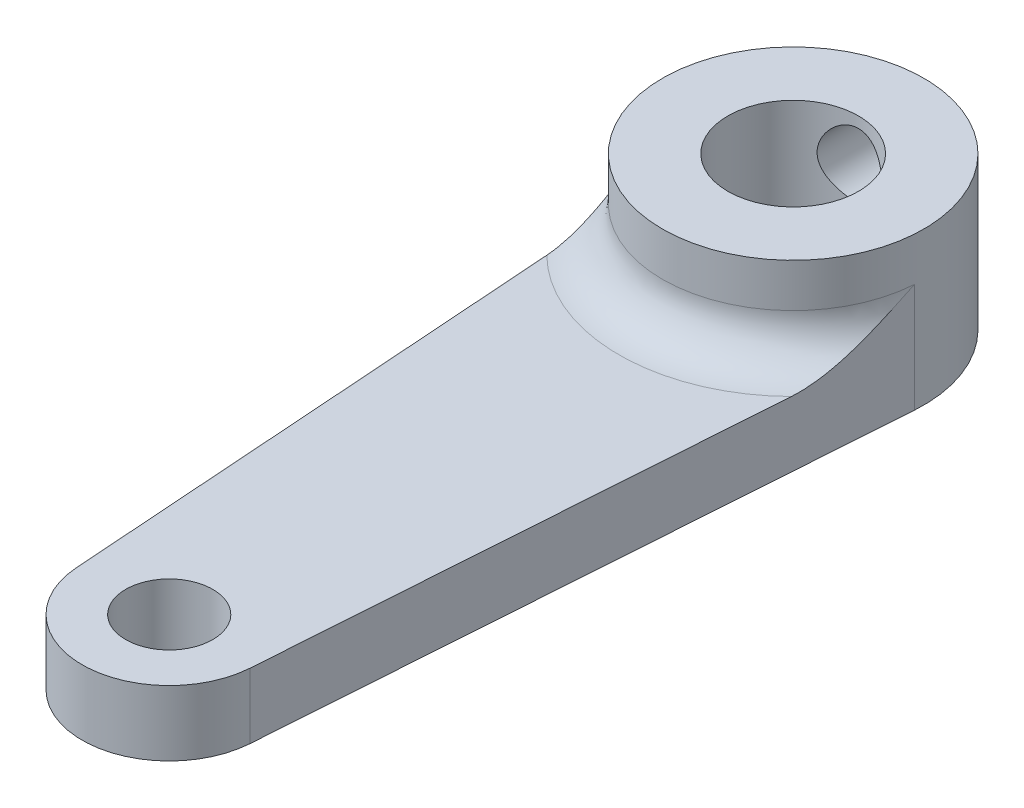
ISO-10303-21;
HEADER;
FILE_DESCRIPTION(('STEP AP214'),'2;1');
FILE_NAME('part.step','',(''),(''),'','','');
FILE_SCHEMA(('AUTOMOTIVE_DESIGN { 1 0 10303 214 1 1 1 1 }'));
ENDSEC;
DATA;
#1=APPLICATION_CONTEXT('core data for automotive mechanical design processes');
#2=APPLICATION_PROTOCOL_DEFINITION('international standard','automotive_design',2000,#1);
#3=PRODUCT_CONTEXT('',#1,'mechanical');
#4=PRODUCT('Part','Part','',(#3));
#5=PRODUCT_RELATED_PRODUCT_CATEGORY('part','',(#4));
#6=PRODUCT_DEFINITION_FORMATION('','',#4);
#7=PRODUCT_DEFINITION_CONTEXT('part definition',#1,'design');
#8=PRODUCT_DEFINITION('design','',#6,#7);
#9=PRODUCT_DEFINITION_SHAPE('','',#8);
#10=(LENGTH_UNIT() NAMED_UNIT(*) SI_UNIT(.MILLI.,.METRE.));
#11=(NAMED_UNIT(*) PLANE_ANGLE_UNIT() SI_UNIT($,.RADIAN.));
#12=(NAMED_UNIT(*) SI_UNIT($,.STERADIAN.) SOLID_ANGLE_UNIT());
#13=UNCERTAINTY_MEASURE_WITH_UNIT(LENGTH_MEASURE(1.E-05),#10,'distance_accuracy_value','');
#14=(GEOMETRIC_REPRESENTATION_CONTEXT(3) GLOBAL_UNCERTAINTY_ASSIGNED_CONTEXT((#13)) GLOBAL_UNIT_ASSIGNED_CONTEXT((#10,
#11,#12)) REPRESENTATION_CONTEXT('',''));
#15=CARTESIAN_POINT('',(0.,0.,0.));
#16=DIRECTION('',(0.,0.,1.));
#17=DIRECTION('',(1.,0.,0.));
#18=AXIS2_PLACEMENT_3D('',#15,#16,#17);
#19=CARTESIAN_POINT('',(-5.98535814810819,1.5,0.418912686457355));
#20=DIRECTION('',(0.997559691351365,0.,-0.0698187810762258));
#21=DIRECTION('',(-0.0698187810762258,0.,-0.997559691351365));
#22=AXIS2_PLACEMENT_3D('',#19,#20,#21);
#23=PLANE('',#22);
#24=DIRECTION('',(0.0698187810762258,0.,0.997559691351365));
#25=VECTOR('',#24,1.);
#26=CARTESIAN_POINT('',(-5.98535814810819,-1.5,0.418912686457355));
#27=LINE('',#26,#25);
#28=CARTESIAN_POINT('',(-5.98535814810819,-1.5,0.418912686457355));
#29=VERTEX_POINT('',#28);
#30=CARTESIAN_POINT('',(-3.99023876540546,-1.5,28.9248625890369));
#31=VERTEX_POINT('',#30);
#32=EDGE_CURVE('E111',#29,#31,#27,.T.);
#33=ORIENTED_EDGE('',*,*,#32,.T.);
#34=DIRECTION('',(0.,-1.,0.));
#35=VECTOR('',#34,1.);
#36=CARTESIAN_POINT('',(-3.99023876540546,1.5,28.9248625890369));
#37=LINE('',#36,#35);
#38=CARTESIAN_POINT('',(-3.99023876540546,1.5,28.9248625890369));
#39=VERTEX_POINT('',#38);
#40=EDGE_CURVE('E104',#39,#31,#37,.T.);
#41=ORIENTED_EDGE('',*,*,#40,.F.);
#42=DIRECTION('',(0.0698187810762258,0.,0.997559691351365));
#43=VECTOR('',#42,1.);
#44=CARTESIAN_POINT('',(-5.98535814810819,1.5,0.418912686457355));
#45=LINE('',#44,#43);
#46=CARTESIAN_POINT('',(-5.61591188496948,1.5,5.69750240897348));
#47=VERTEX_POINT('',#46);
#48=EDGE_CURVE('E89',#47,#39,#45,.T.);
#49=ORIENTED_EDGE('',*,*,#48,.F.);
#50=CARTESIAN_POINT('',(-5.61591188496948,1.5,5.69750240897348));
#51=CARTESIAN_POINT('',(-5.62646580235453,1.50003932371851,5.54670970811425));
#52=CARTESIAN_POINT('',(-5.63700724368848,1.50749080861604,5.39609526309823));
#53=CARTESIAN_POINT('',(-5.65798592108005,1.5352974881444,5.09635524155803));
#54=CARTESIAN_POINT('',(-5.66842333172275,1.55562506504869,4.94722717058997));
#55=CARTESIAN_POINT('',(-5.68901177676282,1.60690972129862,4.6530627271123));
#56=CARTESIAN_POINT('',(-5.69916477169051,1.63771036698734,4.50799834285586));
#57=CARTESIAN_POINT('',(-5.71931793297161,1.70848018103601,4.2200531648187));
#58=CARTESIAN_POINT('',(-5.72931800686936,1.74845467894677,4.07717369202996));
#59=CARTESIAN_POINT('',(-5.76088136861305,1.88804779430901,3.62620137607563));
#60=CARTESIAN_POINT('',(-5.7821296938135,2.00228369716543,3.3226086693289));
#61=CARTESIAN_POINT('',(-5.82388202620795,2.25580816906808,2.72605795368212));
#62=CARTESIAN_POINT('',(-5.84438514311566,2.39512559194236,2.43311266505178));
#63=CARTESIAN_POINT('',(-5.90531581435697,2.83812108027953,1.56254487998891));
#64=CARTESIAN_POINT('',(-5.94488668719295,3.16533067275195,0.997162513177504));
#65=CARTESIAN_POINT('',(-5.98473367163637,3.49483605454573,0.427835107428977));
#66=CARTESIAN_POINT('',(-5.98504591072785,3.49741804396543,0.423373884718887));
#67=CARTESIAN_POINT('',(-5.98535814810819,3.5,0.418912686457355));
#68=B_SPLINE_CURVE_WITH_KNOTS('',3,(#50,#51,#52,#53,#54,#55,#56,#57,#58,#59,#60,#61,#62,#63,#64,
#65,#66,#67),.UNSPECIFIED.,.F.,.F.,(4,2,2,2,2,2,2,2,4),(0.,0.453047985173767,0.905127510167508,
1.35073120961627,1.79659444088085,2.76988627914173,3.74430503334712,5.70583133706974,
5.72132327058452),.UNSPECIFIED.);
#69=CARTESIAN_POINT('',(-5.98535814810819,3.5,0.418912686457355));
#70=VERTEX_POINT('',#69);
#71=EDGE_CURVE('E11',#47,#70,#68,.T.);
#72=ORIENTED_EDGE('',*,*,#71,.T.);
#73=DIRECTION('',(0.,-1.,0.));
#74=VECTOR('',#73,1.);
#75=CARTESIAN_POINT('',(-5.98535814810819,1.5,0.418912686457355));
#76=LINE('',#75,#74);
#77=EDGE_CURVE('E279',#70,#29,#76,.T.);
#78=ORIENTED_EDGE('',*,*,#77,.T.);
#79=EDGE_LOOP('',(#33,#41,#49,#72,#78));
#80=FACE_BOUND('',#79,.T.);
#81=ADVANCED_FACE('F38',(#80),#23,.F.);
#82=CARTESIAN_POINT('',(0.,1.5,28.645587464732));
#83=DIRECTION('',(0.,-1.,0.));
#84=DIRECTION('',(0.,0.,-1.));
#85=AXIS2_PLACEMENT_3D('',#82,#83,#84);
#86=CYLINDRICAL_SURFACE('',#85,4.);
#87=CARTESIAN_POINT('',(0.,-1.5,28.645587464732));
#88=DIRECTION('',(0.,1.,0.));
#89=DIRECTION('',(0.,0.,1.));
#90=AXIS2_PLACEMENT_3D('',#87,#88,#89);
#91=CIRCLE('',#90,4.);
#92=CARTESIAN_POINT('',(3.99023876540546,-1.5,28.9248625890369));
#93=VERTEX_POINT('',#92);
#94=EDGE_CURVE('E281',#31,#93,#91,.T.);
#95=ORIENTED_EDGE('',*,*,#94,.T.);
#96=DIRECTION('',(0.,-1.,0.));
#97=VECTOR('',#96,1.);
#98=CARTESIAN_POINT('',(3.99023876540546,1.5,28.9248625890369));
#99=LINE('',#98,#97);
#100=CARTESIAN_POINT('',(3.99023876540546,1.5,28.9248625890369));
#101=VERTEX_POINT('',#100);
#102=EDGE_CURVE('E106',#101,#93,#99,.T.);
#103=ORIENTED_EDGE('',*,*,#102,.F.);
#104=CARTESIAN_POINT('',(0.,1.5,28.645587464732));
#105=DIRECTION('',(0.,1.,0.));
#106=DIRECTION('',(0.,0.,1.));
#107=AXIS2_PLACEMENT_3D('',#104,#105,#106);
#108=CIRCLE('',#107,4.);
#109=EDGE_CURVE('E93',#39,#101,#108,.T.);
#110=ORIENTED_EDGE('',*,*,#109,.F.);
#111=ORIENTED_EDGE('',*,*,#40,.T.);
#112=EDGE_LOOP('',(#95,#103,#110,#111));
#113=FACE_BOUND('',#112,.T.);
#114=ADVANCED_FACE('F103',(#113),#86,.T.);
#115=CARTESIAN_POINT('',(5.98535814810819,1.5,0.418912686457355));
#116=DIRECTION('',(0.997559691351365,0.,0.0698187810762258));
#117=DIRECTION('',(0.0698187810762258,0.,-0.997559691351365));
#118=AXIS2_PLACEMENT_3D('',#115,#116,#117);
#119=PLANE('',#118);
#120=DIRECTION('',(-0.0698187810762258,0.,0.997559691351365));
#121=VECTOR('',#120,1.);
#122=CARTESIAN_POINT('',(5.98535814810819,-1.5,0.418912686457355));
#123=LINE('',#122,#121);
#124=CARTESIAN_POINT('',(5.98535814810819,-1.5,0.418912686457355));
#125=VERTEX_POINT('',#124);
#126=EDGE_CURVE('E283',#125,#93,#123,.T.);
#127=ORIENTED_EDGE('',*,*,#126,.F.);
#128=DIRECTION('',(0.,-1.,0.));
#129=VECTOR('',#128,1.);
#130=CARTESIAN_POINT('',(5.98535814810819,1.5,0.418912686457355));
#131=LINE('',#130,#129);
#132=CARTESIAN_POINT('',(5.98535814810819,3.5,0.418912686457355));
#133=VERTEX_POINT('',#132);
#134=EDGE_CURVE('E116',#133,#125,#131,.T.);
#135=ORIENTED_EDGE('',*,*,#134,.F.);
#136=CARTESIAN_POINT('',(5.61591188496948,1.5,5.69750240897348));
#137=CARTESIAN_POINT('',(5.62646580235453,1.50003932371851,5.54670970811425));
#138=CARTESIAN_POINT('',(5.63700724368848,1.50749080861604,5.39609526309823));
#139=CARTESIAN_POINT('',(5.65798592108005,1.5352974881444,5.09635524155803));
#140=CARTESIAN_POINT('',(5.66842333172275,1.55562506504869,4.94722717058997));
#141=CARTESIAN_POINT('',(5.68901177676282,1.60690972129862,4.6530627271123));
#142=CARTESIAN_POINT('',(5.69916477169051,1.63771036698734,4.50799834285586));
#143=CARTESIAN_POINT('',(5.71931793297161,1.70848018103601,4.2200531648187));
#144=CARTESIAN_POINT('',(5.72931800686936,1.74845467894677,4.07717369202996));
#145=CARTESIAN_POINT('',(5.76088136861305,1.88804779430901,3.62620137607563));
#146=CARTESIAN_POINT('',(5.7821296938135,2.00228369716543,3.3226086693289));
#147=CARTESIAN_POINT('',(5.82388202620795,2.25580816906808,2.72605795368212));
#148=CARTESIAN_POINT('',(5.84438514311566,2.39512559194236,2.43311266505178));
#149=CARTESIAN_POINT('',(5.90531581435697,2.83812108027953,1.56254487998891));
#150=CARTESIAN_POINT('',(5.94488668719295,3.16533067275195,0.997162513177504));
#151=CARTESIAN_POINT('',(5.98473367163637,3.49483605454573,0.427835107428977));
#152=CARTESIAN_POINT('',(5.98504591072785,3.49741804396543,0.423373884718887));
#153=CARTESIAN_POINT('',(5.98535814810819,3.5,0.418912686457355));
#154=B_SPLINE_CURVE_WITH_KNOTS('',3,(#136,#137,#138,#139,#140,#141,#142,#143,#144,#145,#146,
#147,#148,#149,#150,#151,#152,#153),.UNSPECIFIED.,.F.,.F.,(4,2,2,2,2,2,2,2,4),(0.,
0.453047985173767,0.905127510167508,1.35073120961627,1.79659444088085,2.76988627914173,
3.74430503334712,5.70583133706974,5.72132327058452),.UNSPECIFIED.);
#155=CARTESIAN_POINT('',(5.61591188496948,1.5,5.69750240897348));
#156=VERTEX_POINT('',#155);
#157=EDGE_CURVE('E53',#133,#156,#154,.F.);
#158=ORIENTED_EDGE('',*,*,#157,.T.);
#159=DIRECTION('',(-0.0698187810762258,0.,0.997559691351365));
#160=VECTOR('',#159,1.);
#161=CARTESIAN_POINT('',(5.98535814810819,1.5,0.418912686457355));
#162=LINE('',#161,#160);
#163=EDGE_CURVE('E107',#156,#101,#162,.T.);
#164=ORIENTED_EDGE('',*,*,#163,.T.);
#165=ORIENTED_EDGE('',*,*,#102,.T.);
#166=EDGE_LOOP('',(#127,#135,#158,#164,#165));
#167=FACE_BOUND('',#166,.T.);
#168=ADVANCED_FACE('F130',(#167),#119,.T.);
#169=CARTESIAN_POINT('',(0.,1.5,28.645587464732));
#170=DIRECTION('',(0.,-1.,0.));
#171=DIRECTION('',(0.,0.,-1.));
#172=AXIS2_PLACEMENT_3D('',#169,#170,#171);
#173=CYLINDRICAL_SURFACE('',#172,2.);
#174=CARTESIAN_POINT('',(0.,1.5,28.645587464732));
#175=DIRECTION('',(0.,1.,0.));
#176=DIRECTION('',(0.,0.,1.));
#177=AXIS2_PLACEMENT_3D('',#174,#175,#176);
#178=CIRCLE('',#177,2.);
#179=CARTESIAN_POINT('',(0.,1.5,30.645587464732));
#180=VERTEX_POINT('',#179);
#181=EDGE_CURVE('E276',#180,#180,#178,.T.);
#182=ORIENTED_EDGE('',*,*,#181,.T.);
#183=EDGE_LOOP('',(#182));
#184=FACE_BOUND('',#183,.T.);
#185=CARTESIAN_POINT('',(0.,-1.5,28.645587464732));
#186=DIRECTION('',(0.,1.,0.));
#187=DIRECTION('',(0.,0.,1.));
#188=AXIS2_PLACEMENT_3D('',#185,#186,#187);
#189=CIRCLE('',#188,2.);
#190=CARTESIAN_POINT('',(0.,-1.5,30.645587464732));
#191=VERTEX_POINT('',#190);
#192=EDGE_CURVE('E288',#191,#191,#189,.T.);
#193=ORIENTED_EDGE('',*,*,#192,.F.);
#194=EDGE_LOOP('',(#193));
#195=FACE_BOUND('',#194,.T.);
#196=ADVANCED_FACE('F134',(#184,#195),#173,.F.);
#197=CARTESIAN_POINT('',(0.,1.5,0.));
#198=DIRECTION('',(0.,-1.,0.));
#199=DIRECTION('',(0.,0.,-1.));
#200=AXIS2_PLACEMENT_3D('',#197,#198,#199);
#201=CYLINDRICAL_SURFACE('',#200,6.);
#202=CARTESIAN_POINT('',(0.,5.,-6.));
#203=CARTESIAN_POINT('',(-0.082876088669731,4.99999767426184,-5.99999859868013));
#204=CARTESIAN_POINT('',(-0.165778157830763,4.99310844922621,-5.99826578131828));
#205=CARTESIAN_POINT('',(-0.329206323770532,4.96577484869299,-5.99152113829892));
#206=CARTESIAN_POINT('',(-0.409731046870739,4.94532279046215,-5.98650745419968));
#207=CARTESIAN_POINT('',(-0.566020872182576,4.89156074653791,-5.9737562633204));
#208=CARTESIAN_POINT('',(-0.641791563430002,4.85826620128472,-5.96602202842087));
#209=CARTESIAN_POINT('',(-0.786672131904426,4.77981860995517,-5.94865343807593));
#210=CARTESIAN_POINT('',(-0.855781784348759,4.73466516388106,-5.9390190185405));
#211=CARTESIAN_POINT('',(-0.986801927300918,4.63279921034579,-5.91867413591801));
#212=CARTESIAN_POINT('',(-1.04855569006107,4.57588842504082,-5.90794707148533));
#213=CARTESIAN_POINT('',(-1.1617489272033,4.45254779509108,-5.8867362011753));
#214=CARTESIAN_POINT('',(-1.21318723694913,4.3861168770535,-5.87625242288349));
#215=CARTESIAN_POINT('',(-1.30502654279903,4.24440477326256,-5.8565477569971));
#216=CARTESIAN_POINT('',(-1.34525221592536,4.1690067691896,-5.84734794470605));
#217=CARTESIAN_POINT('',(-1.41239690855053,4.01225158834164,-5.83149494812223));
#218=CARTESIAN_POINT('',(-1.43931805543933,3.93089536667424,-5.82484135672789));
#219=CARTESIAN_POINT('',(-1.47855483680429,3.76625650179753,-5.81500476717551));
#220=CARTESIAN_POINT('',(-1.49115226833334,3.6830451039502,-5.81175491075426));
#221=CARTESIAN_POINT('',(-1.50226177506785,3.51563143098602,-5.80889362537741));
#222=CARTESIAN_POINT('',(-1.50077614181798,3.43142931930139,-5.80928160448644));
#223=CARTESIAN_POINT('',(-1.48398652463928,3.26658419225552,-5.81359205496618));
#224=CARTESIAN_POINT('',(-1.46901834019052,3.1859043785349,-5.81742863001879));
#225=CARTESIAN_POINT('',(-1.42622418690311,3.02823894908871,-5.82806709676484));
#226=CARTESIAN_POINT('',(-1.39839730206942,2.95125359697102,-5.83486919970697));
#227=CARTESIAN_POINT('',(-1.33038947793715,2.80226198374794,-5.85075113904187));
#228=CARTESIAN_POINT('',(-1.29008666723291,2.73031382821045,-5.85985327469421));
#229=CARTESIAN_POINT('',(-1.19835627601495,2.59408129024316,-5.87929710846386));
#230=CARTESIAN_POINT('',(-1.14692674880884,2.52979825193275,-5.88963902334735));
#231=CARTESIAN_POINT('',(-1.03266342468122,2.4087963843056,-5.91075880539781));
#232=CARTESIAN_POINT('',(-0.969546258165859,2.35234550993865,-5.92154069477971));
#233=CARTESIAN_POINT('',(-0.834611917503699,2.2507787575361,-5.94205965578786));
#234=CARTESIAN_POINT('',(-0.762794477707943,2.20566322573644,-5.95179669549415));
#235=CARTESIAN_POINT('',(-0.612115888681391,2.12794941377562,-5.96917732094183));
#236=CARTESIAN_POINT('',(-0.533231393208623,2.09539465974557,-5.97681360127725));
#237=CARTESIAN_POINT('',(-0.370876008142883,2.04408269429043,-5.98907916991419));
#238=CARTESIAN_POINT('',(-0.287405999150485,2.02532284358186,-5.99370903339281));
#239=CARTESIAN_POINT('',(-0.120539970390027,2.00254243444116,-5.99935499271375));
#240=CARTESIAN_POINT('',(-0.0371967199882099,1.9981569739247,-6.00046053508279));
#241=CARTESIAN_POINT('',(0.129032874801508,2.00324900205549,-5.99918804814451));
#242=CARTESIAN_POINT('',(0.211919259644594,2.01272524279913,-5.99681033241847));
#243=CARTESIAN_POINT('',(0.373614268776491,2.04497090839138,-5.98889581127357));
#244=CARTESIAN_POINT('',(0.452465118968754,2.06754126347699,-5.98340634185811));
#245=CARTESIAN_POINT('',(0.605257292452511,2.12510708402845,-5.96988706634134));
#246=CARTESIAN_POINT('',(0.679198119032633,2.16010380431317,-5.96185700369892));
#247=CARTESIAN_POINT('',(0.821523134429846,2.24223612887473,-5.9439330792631));
#248=CARTESIAN_POINT('',(0.889785441835829,2.28957611239676,-5.93400867366932));
#249=CARTESIAN_POINT('',(1.01752661364324,2.39478990879697,-5.91344509187419));
#250=CARTESIAN_POINT('',(1.07700395897301,2.45266553961691,-5.90280579251705));
#251=CARTESIAN_POINT('',(1.18699056807273,2.57900196084446,-5.88168956960771));
#252=CARTESIAN_POINT('',(1.23724386762203,2.64768770300242,-5.87122304187281));
#253=CARTESIAN_POINT('',(1.3255107590127,2.79273263446572,-5.85192878377239));
#254=CARTESIAN_POINT('',(1.36352489415793,2.86909148295975,-5.84310098067026));
#255=CARTESIAN_POINT('',(1.42595142060929,3.02690572241308,-5.82818094734665));
#256=CARTESIAN_POINT('',(1.45044439665406,3.10832762834401,-5.82207255291906));
#257=CARTESIAN_POINT('',(1.48534565995378,3.27430963788911,-5.81326744090184));
#258=CARTESIAN_POINT('',(1.49575702747866,3.35886905103249,-5.81056997719936));
#259=CARTESIAN_POINT('',(1.50203859033399,3.5261210238552,-5.80894901203957));
#260=CARTESIAN_POINT('',(1.49831789778012,3.60879743512473,-5.80991932728264));
#261=CARTESIAN_POINT('',(1.47737727831287,3.77230388866798,-5.81527909007843));
#262=CARTESIAN_POINT('',(1.46015762268677,3.85313396801365,-5.81966846891857));
#263=CARTESIAN_POINT('',(1.41293131944279,4.01020845906541,-5.83131260682722));
#264=CARTESIAN_POINT('',(1.38300140468037,4.08647730524021,-5.83855015236309));
#265=CARTESIAN_POINT('',(1.31126491360507,4.23296538271369,-5.85507755724829));
#266=CARTESIAN_POINT('',(1.26945669003419,4.30318377318691,-5.86436770120773));
#267=CARTESIAN_POINT('',(1.17386774863714,4.43755462900202,-5.88425634263512));
#268=CARTESIAN_POINT('',(1.11980316291225,4.50150107342396,-5.89488264831757));
#269=CARTESIAN_POINT('',(1.00178937118973,4.61954704479541,-5.91608027246286));
#270=CARTESIAN_POINT('',(0.937837821261145,4.67364423011297,-5.9266515772706));
#271=CARTESIAN_POINT('',(0.80046758670259,4.77141130856461,-5.94677655647663));
#272=CARTESIAN_POINT('',(0.726898422316386,4.81487461367158,-5.95630833365868));
#273=CARTESIAN_POINT('',(0.573266059510476,4.88874746294053,-5.97304924975118));
#274=CARTESIAN_POINT('',(0.49320756343674,4.91916636064853,-5.98026005199781));
#275=CARTESIAN_POINT('',(0.344410253243472,4.96157183032965,-5.99048059565542));
#276=CARTESIAN_POINT('',(0.276380170908069,4.97595124305343,-5.99402585052691));
#277=CARTESIAN_POINT('',(0.138906071536283,4.99516594362194,-5.99878605231948));
#278=CARTESIAN_POINT('',(0.0694621612426163,5.0000019493053,-6.00000117450894));
#279=CARTESIAN_POINT('',(0.,5.,-6.));
#280=B_SPLINE_CURVE_WITH_KNOTS('',3,(#202,#203,#204,#205,#206,#207,#208,#209,#210,#211,#212,
#213,#214,#215,#216,#217,#218,#219,#220,#221,#222,#223,#224,#225,#226,#227,#228,#229,#230,#231,
#232,#233,#234,#235,#236,#237,#238,#239,#240,#241,#242,#243,#244,#245,#246,#247,#248,#249,#250,
#251,#252,#253,#254,#255,#256,#257,#258,#259,#260,#261,#262,#263,#264,#265,#266,#267,#268,#269,
#270,#271,#272,#273,#274,#275,#276,#277,#278,#279),.UNSPECIFIED.,.T.,.F.,(4,2,2,2,2,2,2,2,2,2,2,
2,2,2,2,2,2,2,2,2,2,2,2,2,2,2,2,2,2,2,2,2,2,2,2,2,2,2,4),(0.,0.248373712471889,
0.496888237763899,0.745104902286105,0.993329940169327,1.24614435437139,1.49898729580062,
1.75558647545807,2.01214461169368,2.2635629509943,2.51494038112697,2.76022497007018,
3.00552703466038,3.25330527873879,3.50112690836162,3.75601500969019,4.01091089558247,
4.26668229009114,4.52240473688642,4.77158308949276,5.02073901112742,5.26620274514037,
5.5116912732229,5.76153587565351,6.01142363008018,6.26744509204475,6.52345518749507,
6.77792254614036,7.03233423252407,7.27943780398612,7.52653640956034,7.77216400559446,
8.017825681369,8.26989576409909,8.52202569770417,8.77872185499587,9.03523363821349,
9.24342242942148,9.45159556043039),.UNSPECIFIED.);
#281=CARTESIAN_POINT('',(0.,5.,-6.));
#282=VERTEX_POINT('',#281);
#283=EDGE_CURVE('E43',#282,#282,#280,.T.);
#284=ORIENTED_EDGE('',*,*,#283,.T.);
#285=EDGE_LOOP('',(#284));
#286=FACE_BOUND('',#285,.T.);
#287=CARTESIAN_POINT('',(0.,3.5,0.));
#288=DIRECTION('',(0.,1.,0.));
#289=DIRECTION('',(0.,0.,1.));
#290=AXIS2_PLACEMENT_3D('',#287,#288,#289);
#291=CIRCLE('',#290,6.);
#292=EDGE_CURVE('E112',#70,#133,#291,.T.);
#293=ORIENTED_EDGE('',*,*,#292,.T.);
#294=ORIENTED_EDGE('',*,*,#134,.T.);
#295=CARTESIAN_POINT('',(0.,-1.5,0.));
#296=DIRECTION('',(0.,1.,0.));
#297=DIRECTION('',(0.,0.,1.));
#298=AXIS2_PLACEMENT_3D('',#295,#296,#297);
#299=CIRCLE('',#298,6.);
#300=EDGE_CURVE('E286',#125,#29,#299,.T.);
#301=ORIENTED_EDGE('',*,*,#300,.T.);
#302=ORIENTED_EDGE('',*,*,#77,.F.);
#303=EDGE_LOOP('',(#293,#294,#301,#302));
#304=FACE_BOUND('',#303,.T.);
#305=CARTESIAN_POINT('',(0.,5.5,0.));
#306=DIRECTION('',(0.,1.,0.));
#307=DIRECTION('',(0.,0.,1.));
#308=AXIS2_PLACEMENT_3D('',#305,#306,#307);
#309=CIRCLE('',#308,6.);
#310=CARTESIAN_POINT('',(0.,5.5,6.));
#311=VERTEX_POINT('',#310);
#312=EDGE_CURVE('E272',#311,#311,#309,.T.);
#313=ORIENTED_EDGE('',*,*,#312,.F.);
#314=EDGE_LOOP('',(#313));
#315=FACE_BOUND('',#314,.T.);
#316=ADVANCED_FACE('F135',(#286,#304,#315),#201,.T.);
#317=CARTESIAN_POINT('',(0.,1.5,0.));
#318=DIRECTION('',(0.,-1.,0.));
#319=DIRECTION('',(0.,0.,-1.));
#320=AXIS2_PLACEMENT_3D('',#317,#318,#319);
#321=CYLINDRICAL_SURFACE('',#320,3.);
#322=CARTESIAN_POINT('',(0.,5.,-3.));
#323=CARTESIAN_POINT('',(-0.0788579444268501,4.99999504652421,-2.99999570107562));
#324=CARTESIAN_POINT('',(-0.157809899546343,4.99374489031841,-2.99685736529635));
#325=CARTESIAN_POINT('',(-0.313380352903344,4.96902067948769,-2.98461234055736));
#326=CARTESIAN_POINT('',(-0.389994130070444,4.95052341050328,-2.97549431743379));
#327=CARTESIAN_POINT('',(-0.538400317320673,4.90220928707506,-2.95224419105063));
#328=CARTESIAN_POINT('',(-0.610210204408719,4.87243642362805,-2.93813158766306));
#329=CARTESIAN_POINT('',(-0.747708925209897,4.80264406795252,-2.90618664773642));
#330=CARTESIAN_POINT('',(-0.813398240985088,4.7626253836267,-2.88835460450288));
#331=CARTESIAN_POINT('',(-0.941261726642863,4.67072412577207,-2.84934387387093));
#332=CARTESIAN_POINT('',(-1.00298281668316,4.61827028114054,-2.82802798691306));
#333=CARTESIAN_POINT('',(-1.11716916730047,4.50421778112944,-2.78489955370115));
#334=CARTESIAN_POINT('',(-1.16962737466015,4.44261222234134,-2.76308664313552));
#335=CARTESIAN_POINT('',(-1.26787800067542,4.30627497571493,-2.71948426796021));
#336=CARTESIAN_POINT('',(-1.31283800332745,4.23089585248113,-2.69782780455198));
#337=CARTESIAN_POINT('',(-1.38925234033604,4.07244899602068,-2.65928968158481));
#338=CARTESIAN_POINT('',(-1.4207163224495,3.98938680691588,-2.64240461410485));
#339=CARTESIAN_POINT('',(-1.46719866328288,3.82300234186712,-2.61686800556713));
#340=CARTESIAN_POINT('',(-1.48308878562066,3.73999332189891,-2.6077840737557));
#341=CARTESIAN_POINT('',(-1.50064048996327,3.57203174333078,-2.59772834922792));
#342=CARTESIAN_POINT('',(-1.50231613255961,3.48708118869327,-2.59674854014932));
#343=CARTESIAN_POINT('',(-1.49203093075844,3.32857096352695,-2.60266395385873));
#344=CARTESIAN_POINT('',(-1.48167683930523,3.25486395316542,-2.6086314549302));
#345=CARTESIAN_POINT('',(-1.4504097735854,3.11041713594044,-2.62614343100776));
#346=CARTESIAN_POINT('',(-1.42949343584648,3.03967828204203,-2.63768968247665));
#347=CARTESIAN_POINT('',(-1.377314670579,2.90115630115151,-2.66531214619112));
#348=CARTESIAN_POINT('',(-1.34582260067399,2.83348040182132,-2.68148760995998));
#349=CARTESIAN_POINT('',(-1.273562531502,2.70404856111499,-2.71655106422106));
#350=CARTESIAN_POINT('',(-1.2327903657187,2.64229529659987,-2.73544027170286));
#351=CARTESIAN_POINT('',(-1.13709908236918,2.51821812088516,-2.77669736854929));
#352=CARTESIAN_POINT('',(-1.08104168755392,2.45681468963576,-2.79920265355119));
#353=CARTESIAN_POINT('',(-0.959333368112059,2.34389687211365,-2.84321434950611));
#354=CARTESIAN_POINT('',(-0.893677884861426,2.29238721194918,-2.86472027938201));
#355=CARTESIAN_POINT('',(-0.750774758747771,2.19847150845541,-2.90552980924446));
#356=CARTESIAN_POINT('',(-0.673130387399112,2.15659929133139,-2.92468476243011));
#357=CARTESIAN_POINT('',(-0.510699323233194,2.08685445643549,-2.95736821681863));
#358=CARTESIAN_POINT('',(-0.425918364397913,2.05897072247725,-2.9709011841533));
#359=CARTESIAN_POINT('',(-0.259149737491053,2.02028689442499,-2.98986500612153));
#360=CARTESIAN_POINT('',(-0.177512295822489,2.00826314637983,-2.99587407451965));
#361=CARTESIAN_POINT('',(-0.0131693999240272,1.99780290329827,-3.00109520188655));
#362=CARTESIAN_POINT('',(0.0695355298048634,1.9993599715408,-3.00031048081978));
#363=CARTESIAN_POINT('',(0.226849457978981,2.01531003262812,-2.99236788380152));
#364=CARTESIAN_POINT('',(0.301589112074895,2.02869879909499,-2.98570868532253));
#365=CARTESIAN_POINT('',(0.447610338452911,2.06635710784268,-2.9673325697226));
#366=CARTESIAN_POINT('',(0.51889152853663,2.09062784968024,-2.95561509501618));
#367=CARTESIAN_POINT('',(0.658332912674359,2.14999769964955,-2.92776377120382));
#368=CARTESIAN_POINT('',(0.726345595508705,2.18538657517443,-2.91151322654446));
#369=CARTESIAN_POINT('',(0.855692042548907,2.26566130346985,-2.87615961476126));
#370=CARTESIAN_POINT('',(0.917022944664887,2.31055120189309,-2.85705533350407));
#371=CARTESIAN_POINT('',(1.03765153393382,2.41364063799608,-2.81562332004297));
#372=CARTESIAN_POINT('',(1.09615811672854,2.47271430266772,-2.79316327265249));
#373=CARTESIAN_POINT('',(1.20278448167828,2.59988772691659,-2.7489358741323));
#374=CARTESIAN_POINT('',(1.25089707856781,2.66799367827188,-2.72716901100071));
#375=CARTESIAN_POINT('',(1.33756187171853,2.81546548125946,-2.68576788309734));
#376=CARTESIAN_POINT('',(1.37553824370037,2.89521689914172,-2.66628794383591));
#377=CARTESIAN_POINT('',(1.43712423890205,3.06126510136245,-2.63361108441202));
#378=CARTESIAN_POINT('',(1.46075237380052,3.14755328970034,-2.62040607332625));
#379=CARTESIAN_POINT('',(1.49079253120031,3.31536533432706,-2.60342251538703));
#380=CARTESIAN_POINT('',(1.49863949460818,3.39655138015286,-2.59886075197597));
#381=CARTESIAN_POINT('',(1.5010337315643,3.55917060074679,-2.59748031962405));
#382=CARTESIAN_POINT('',(1.49558676993486,3.64060365310679,-2.60065829439585));
#383=CARTESIAN_POINT('',(1.47288918838996,3.79322525230016,-2.61356793076615));
#384=CARTESIAN_POINT('',(1.45681247151455,3.86465070521711,-2.62264641723988));
#385=CARTESIAN_POINT('',(1.41476303733662,4.00371217913655,-2.64556524281479));
#386=CARTESIAN_POINT('',(1.38878713673988,4.07134697313805,-2.65940711354503));
#387=CARTESIAN_POINT('',(1.32572361795085,4.2059372764798,-2.69142795546804));
#388=CARTESIAN_POINT('',(1.28800670672355,4.27254185274354,-2.70983583593881));
#389=CARTESIAN_POINT('',(1.20322645745609,4.39891180427189,-2.74852997452291));
#390=CARTESIAN_POINT('',(1.15615825686234,4.45867359578167,-2.76881720693416));
#391=CARTESIAN_POINT('',(1.04730498999206,4.57721297353201,-2.81193484737138));
#392=CARTESIAN_POINT('',(0.98442663449589,4.63498865352544,-2.83477474959942));
#393=CARTESIAN_POINT('',(0.849232209349795,4.7393944751529,-2.87816628389896));
#394=CARTESIAN_POINT('',(0.776911084957795,4.78601860920486,-2.89871667939293));
#395=CARTESIAN_POINT('',(0.623897395174418,4.8668545440681,-2.93547014349806));
#396=CARTESIAN_POINT('',(0.543149255665095,4.9009762538547,-2.95164144740899));
#397=CARTESIAN_POINT('',(0.376113151707129,4.95471225163611,-2.9775201194848));
#398=CARTESIAN_POINT('',(0.289841699383649,4.97436777020857,-2.98724585044602));
#399=CARTESIAN_POINT('',(0.168902919736342,4.99084611662861,-2.99543192870217));
#400=CARTESIAN_POINT('',(0.135242819162347,4.99427396129951,-2.99714048010376));
#401=CARTESIAN_POINT('',(0.067727597707637,4.99885199827113,-2.99942545465223));
#402=CARTESIAN_POINT('',(0.0338724714699425,5.00000212770531,-3.00000184655071));
#403=CARTESIAN_POINT('',(0.,5.,-3.));
#404=B_SPLINE_CURVE_WITH_KNOTS('',3,(#322,#323,#324,#325,#326,#327,#328,#329,#330,#331,#332,
#333,#334,#335,#336,#337,#338,#339,#340,#341,#342,#343,#344,#345,#346,#347,#348,#349,#350,#351,
#352,#353,#354,#355,#356,#357,#358,#359,#360,#361,#362,#363,#364,#365,#366,#367,#368,#369,#370,
#371,#372,#373,#374,#375,#376,#377,#378,#379,#380,#381,#382,#383,#384,#385,#386,#387,#388,#389,
#390,#391,#392,#393,#394,#395,#396,#397,#398,#399,#400,#401,#402,#403),.UNSPECIFIED.,.T.,.F.,(4,
2,2,2,2,2,2,2,2,2,2,2,2,2,2,2,2,2,2,2,2,2,2,2,2,2,2,2,2,2,2,2,2,2,2,2,2,2,2,2,4),(0.,
0.236436386130438,0.473322224563796,0.709293233238447,0.94524564087235,1.19547263807713,
1.44588935648105,1.71572589646129,1.98536921847421,2.23887018210344,2.4921203599353,
2.71508568613981,2.93812205888517,3.16635360252731,3.39468781890332,3.65197412000817,
3.90938301898029,4.17874533321661,4.44789325368419,4.69474935707018,4.94148846767214,
5.16910359759182,5.39674382446397,5.63089284041847,5.86514176122508,6.12239415966628,
6.37982382923147,6.64972023242588,6.91926767918175,7.16293961254569,7.40650589797017,
7.62686895373283,7.84730293182526,8.0825468517043,8.31791341715445,8.58187864135757,
8.84598575071868,9.11196020495289,9.37717362931723,9.47872920200875,9.58028757766598),.UNSPECIFIED.);
#405=CARTESIAN_POINT('',(0.,5.,-3.));
#406=VERTEX_POINT('',#405);
#407=EDGE_CURVE('E263',#406,#406,#404,.T.);
#408=ORIENTED_EDGE('',*,*,#407,.F.);
#409=EDGE_LOOP('',(#408));
#410=FACE_BOUND('',#409,.T.);
#411=CARTESIAN_POINT('',(0.,-1.5,0.));
#412=DIRECTION('',(0.,1.,0.));
#413=DIRECTION('',(0.,0.,1.));
#414=AXIS2_PLACEMENT_3D('',#411,#412,#413);
#415=CIRCLE('',#414,3.);
#416=CARTESIAN_POINT('',(0.,-1.5,3.));
#417=VERTEX_POINT('',#416);
#418=EDGE_CURVE('E98',#417,#417,#415,.T.);
#419=ORIENTED_EDGE('',*,*,#418,.F.);
#420=EDGE_LOOP('',(#419));
#421=FACE_BOUND('',#420,.T.);
#422=CARTESIAN_POINT('',(0.,5.5,0.));
#423=DIRECTION('',(0.,1.,0.));
#424=DIRECTION('',(0.,0.,1.));
#425=AXIS2_PLACEMENT_3D('',#422,#423,#424);
#426=CIRCLE('',#425,3.);
#427=CARTESIAN_POINT('',(0.,5.5,3.));
#428=VERTEX_POINT('',#427);
#429=EDGE_CURVE('E268',#428,#428,#426,.T.);
#430=ORIENTED_EDGE('',*,*,#429,.T.);
#431=EDGE_LOOP('',(#430));
#432=FACE_BOUND('',#431,.T.);
#433=ADVANCED_FACE('F166',(#410,#421,#432),#321,.F.);
#434=CARTESIAN_POINT('',(0.,1.5,0.));
#435=DIRECTION('',(0.,1.,0.));
#436=DIRECTION('',(0.,0.,1.));
#437=AXIS2_PLACEMENT_3D('',#434,#435,#436);
#438=PLANE('',#437);
#439=ORIENTED_EDGE('',*,*,#163,.F.);
#440=CARTESIAN_POINT('',(0.,1.5,0.));
#441=DIRECTION('',(0.,1.,0.));
#442=DIRECTION('',(0.,0.,1.));
#443=AXIS2_PLACEMENT_3D('',#440,#441,#442);
#444=CIRCLE('',#443,8.);
#445=EDGE_CURVE('E66',#156,#47,#444,.F.);
#446=ORIENTED_EDGE('',*,*,#445,.T.);
#447=ORIENTED_EDGE('',*,*,#48,.T.);
#448=ORIENTED_EDGE('',*,*,#109,.T.);
#449=EDGE_LOOP('',(#439,#446,#447,#448));
#450=FACE_BOUND('',#449,.T.);
#451=ORIENTED_EDGE('',*,*,#181,.F.);
#452=EDGE_LOOP('',(#451));
#453=FACE_BOUND('',#452,.T.);
#454=ADVANCED_FACE('F91',(#450,#453),#438,.T.);
#455=CARTESIAN_POINT('',(0.,-1.5,0.));
#456=DIRECTION('',(0.,1.,0.));
#457=DIRECTION('',(0.,0.,1.));
#458=AXIS2_PLACEMENT_3D('',#455,#456,#457);
#459=PLANE('',#458);
#460=ORIENTED_EDGE('',*,*,#32,.F.);
#461=ORIENTED_EDGE('',*,*,#300,.F.);
#462=ORIENTED_EDGE('',*,*,#126,.T.);
#463=ORIENTED_EDGE('',*,*,#94,.F.);
#464=EDGE_LOOP('',(#460,#461,#462,#463));
#465=FACE_BOUND('',#464,.T.);
#466=ORIENTED_EDGE('',*,*,#192,.T.);
#467=EDGE_LOOP('',(#466));
#468=FACE_BOUND('',#467,.T.);
#469=ORIENTED_EDGE('',*,*,#418,.T.);
#470=EDGE_LOOP('',(#469));
#471=FACE_BOUND('',#470,.T.);
#472=ADVANCED_FACE('F181',(#465,#468,#471),#459,.F.);
#473=CARTESIAN_POINT('',(0.,5.5,0.));
#474=DIRECTION('',(0.,1.,0.));
#475=DIRECTION('',(0.,0.,1.));
#476=AXIS2_PLACEMENT_3D('',#473,#474,#475);
#477=PLANE('',#476);
#478=ORIENTED_EDGE('',*,*,#312,.T.);
#479=EDGE_LOOP('',(#478));
#480=FACE_BOUND('',#479,.T.);
#481=ORIENTED_EDGE('',*,*,#429,.F.);
#482=EDGE_LOOP('',(#481));
#483=FACE_BOUND('',#482,.T.);
#484=ADVANCED_FACE('F187',(#480,#483),#477,.T.);
#485=CARTESIAN_POINT('',(0.,3.5,0.));
#486=DIRECTION('',(0.,1.,0.));
#487=DIRECTION('',(0.,0.,1.));
#488=AXIS2_PLACEMENT_3D('',#485,#486,#487);
#489=TOROIDAL_SURFACE('',#488,8.,2.);
#490=ORIENTED_EDGE('',*,*,#71,.F.);
#491=ORIENTED_EDGE('',*,*,#445,.F.);
#492=ORIENTED_EDGE('',*,*,#157,.F.);
#493=ORIENTED_EDGE('',*,*,#292,.F.);
#494=EDGE_LOOP('',(#490,#491,#492,#493));
#495=FACE_BOUND('',#494,.T.);
#496=ADVANCED_FACE('F40',(#495),#489,.F.);
#497=CARTESIAN_POINT('',(0.,3.5,-8.));
#498=DIRECTION('',(0.,0.,-1.));
#499=DIRECTION('',(-1.,0.,0.));
#500=AXIS2_PLACEMENT_3D('',#497,#498,#499);
#501=CYLINDRICAL_SURFACE('',#500,1.5);
#502=ORIENTED_EDGE('',*,*,#407,.T.);
#503=EDGE_LOOP('',(#502));
#504=FACE_BOUND('',#503,.T.);
#505=ORIENTED_EDGE('',*,*,#283,.F.);
#506=EDGE_LOOP('',(#505));
#507=FACE_BOUND('',#506,.T.);
#508=ADVANCED_FACE('F200',(#504,#507),#501,.F.);
#509=CLOSED_SHELL('',(#81,#114,#168,#196,#316,#433,#454,#472,#484,#496,#508));
#510=MANIFOLD_SOLID_BREP('B2',#509);
#511=ADVANCED_BREP_SHAPE_REPRESENTATION('',(#18,#510),#14);
#512=SHAPE_DEFINITION_REPRESENTATION(#9,#511);
ENDSEC;
END-ISO-10303-21;
